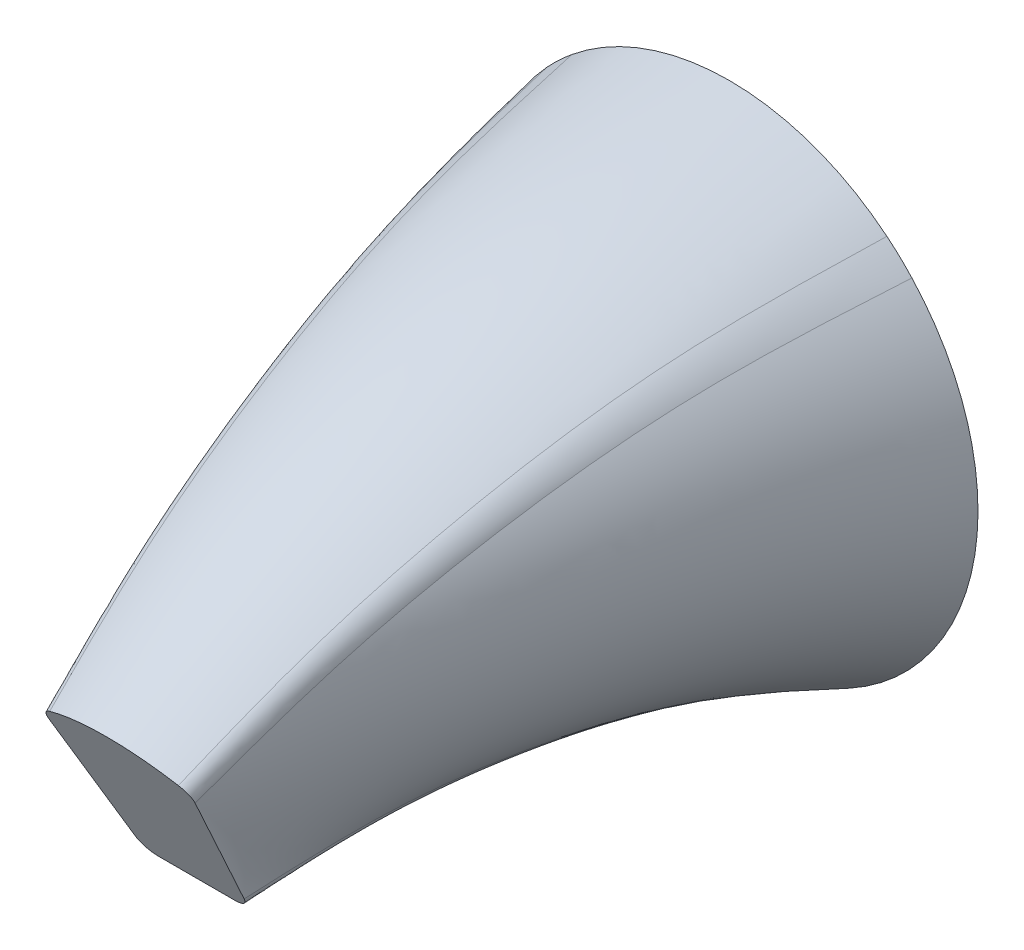
ISO-10303-21;
HEADER;
FILE_DESCRIPTION(('STEP AP214'),'2;1');
FILE_NAME('part.step','',(''),(''),'','','');
FILE_SCHEMA(('AUTOMOTIVE_DESIGN { 1 0 10303 214 1 1 1 1 }'));
ENDSEC;
DATA;
#1=APPLICATION_CONTEXT('core data for automotive mechanical design processes');
#2=APPLICATION_PROTOCOL_DEFINITION('international standard','automotive_design',2000,#1);
#3=PRODUCT_CONTEXT('',#1,'mechanical');
#4=PRODUCT('Part','Part','',(#3));
#5=PRODUCT_RELATED_PRODUCT_CATEGORY('part','',(#4));
#6=PRODUCT_DEFINITION_FORMATION('','',#4);
#7=PRODUCT_DEFINITION_CONTEXT('part definition',#1,'design');
#8=PRODUCT_DEFINITION('design','',#6,#7);
#9=PRODUCT_DEFINITION_SHAPE('','',#8);
#10=(LENGTH_UNIT() NAMED_UNIT(*) SI_UNIT(.MILLI.,.METRE.));
#11=(NAMED_UNIT(*) PLANE_ANGLE_UNIT() SI_UNIT($,.RADIAN.));
#12=(NAMED_UNIT(*) SI_UNIT($,.STERADIAN.) SOLID_ANGLE_UNIT());
#13=UNCERTAINTY_MEASURE_WITH_UNIT(LENGTH_MEASURE(1.E-05),#10,'distance_accuracy_value','');
#14=(GEOMETRIC_REPRESENTATION_CONTEXT(3) GLOBAL_UNCERTAINTY_ASSIGNED_CONTEXT((#13)) GLOBAL_UNIT_ASSIGNED_CONTEXT((#10,
#11,#12)) REPRESENTATION_CONTEXT('',''));
#15=CARTESIAN_POINT('',(0.,0.,0.));
#16=DIRECTION('',(0.,0.,1.));
#17=DIRECTION('',(1.,0.,0.));
#18=AXIS2_PLACEMENT_3D('',#15,#16,#17);
#19=CARTESIAN_POINT('',(-5.69104030061183,-24.6110355064771,82.9682517629207));
#20=DIRECTION('',(0.,-0.473205765637584,0.880951930225111));
#21=DIRECTION('',(0.,-0.880951930225111,-0.473205765637584));
#22=AXIS2_PLACEMENT_3D('',#19,#20,#21);
#23=PLANE('',#22);
#24=CARTESIAN_POINT('',(-5.69104030061183,-24.6110355064771,82.9682517629207));
#25=DIRECTION('',(0.,-0.473205765637584,0.880951930225111));
#26=DIRECTION('',(0.,-0.880951930225111,-0.473205765637584));
#27=AXIS2_PLACEMENT_3D('',#24,#25,#26);
#28=CIRCLE('',#27,2.54);
#29=CARTESIAN_POINT('',(-8.20944139143489,-24.9022243635643,82.8118388630388));
#30=VERTEX_POINT('',#29);
#31=CARTESIAN_POINT('',(-5.69104030061181,-26.8486534092489,81.7663091182012));
#32=VERTEX_POINT('',#31);
#33=EDGE_CURVE('E467',#30,#32,#28,.T.);
#34=ORIENTED_EDGE('',*,*,#33,.T.);
#35=DIRECTION('',(1.,0.,0.));
#36=VECTOR('',#35,1.);
#37=CARTESIAN_POINT('',(-5.69104030061181,-26.8486534092489,81.7663091182012));
#38=LINE('',#37,#36);
#39=CARTESIAN_POINT('',(5.92490500795103,-26.8486534092489,81.7663091182012));
#40=VERTEX_POINT('',#39);
#41=EDGE_CURVE('E487',#32,#40,#38,.T.);
#42=ORIENTED_EDGE('',*,*,#41,.T.);
#43=CARTESIAN_POINT('',(5.92490500795105,-24.6110355064771,82.9682517629207));
#44=DIRECTION('',(0.,-0.473205765637584,0.880951930225111));
#45=DIRECTION('',(0.,0.880951930225111,0.473205765637584));
#46=AXIS2_PLACEMENT_3D('',#43,#44,#45);
#47=CIRCLE('',#46,2.54);
#48=CARTESIAN_POINT('',(8.44330609877411,-24.9022243635643,82.8118388630388));
#49=VERTEX_POINT('',#48);
#50=EDGE_CURVE('E816',#40,#49,#47,.T.);
#51=ORIENTED_EDGE('',*,*,#50,.T.);
#52=DIRECTION('',(0.130133414076854,0.873460748835276,0.469181856836793));
#53=VECTOR('',#52,1.);
#54=CARTESIAN_POINT('',(11.3244534424501,-5.56384663664375,93.1995019403169));
#55=LINE('',#54,#53);
#56=CARTESIAN_POINT('',(11.3244534424501,-5.56384663664375,93.1995019403169));
#57=VERTEX_POINT('',#56);
#58=EDGE_CURVE('E807',#49,#57,#55,.T.);
#59=ORIENTED_EDGE('',*,*,#58,.T.);
#60=CARTESIAN_POINT('',(8.806052351627,-5.27265777955657,93.3559148401988));
#61=DIRECTION('',(0.,-0.473205765637584,0.880951930225111));
#62=DIRECTION('',(0.,0.880951930225111,0.473205765637584));
#63=AXIS2_PLACEMENT_3D('',#60,#61,#62);
#64=CIRCLE('',#63,2.54);
#65=CARTESIAN_POINT('',(9.97102754752189,-3.28427437344351,94.4239804857674));
#66=VERTEX_POINT('',#65);
#67=EDGE_CURVE('E798',#57,#66,#64,.T.);
#68=ORIENTED_EDGE('',*,*,#67,.T.);
#69=CARTESIAN_POINT('',(0.116932353669608,-20.1032757004745,85.389607409153));
#70=DIRECTION('',(0.,-0.473205765637584,0.880951930225111));
#71=DIRECTION('',(0.,-0.880951930225111,-0.473205765637584));
#72=AXIS2_PLACEMENT_3D('',#69,#70,#71);
#73=CIRCLE('',#72,21.4849224949877);
#74=CARTESIAN_POINT('',(-9.73716284018267,-3.28427437344351,94.4239804857674));
#75=VERTEX_POINT('',#74);
#76=EDGE_CURVE('E694',#66,#75,#73,.T.);
#77=ORIENTED_EDGE('',*,*,#76,.T.);
#78=CARTESIAN_POINT('',(-8.57218764428778,-5.27265777955656,93.3559148401988));
#79=DIRECTION('',(0.,-0.473205765637584,0.880951930225111));
#80=DIRECTION('',(0.,0.880951930225111,0.473205765637584));
#81=AXIS2_PLACEMENT_3D('',#78,#79,#80);
#82=CIRCLE('',#81,2.54);
#83=CARTESIAN_POINT('',(-11.0905887351108,-5.56384663664375,93.1995019403169));
#84=VERTEX_POINT('',#83);
#85=EDGE_CURVE('E469',#75,#84,#82,.T.);
#86=ORIENTED_EDGE('',*,*,#85,.T.);
#87=DIRECTION('',(0.130133414076854,-0.873460748835276,-0.469181856836793));
#88=VECTOR('',#87,1.);
#89=CARTESIAN_POINT('',(-11.0905887351108,-5.56384663664375,93.1995019403169));
#90=LINE('',#89,#88);
#91=EDGE_CURVE('E463',#84,#30,#90,.T.);
#92=ORIENTED_EDGE('',*,*,#91,.T.);
#93=EDGE_LOOP('',(#34,#42,#51,#59,#68,#77,#86,#92));
#94=FACE_BOUND('',#93,.T.);
#95=ADVANCED_FACE('F411',(#94),#23,.T.);
#96=CARTESIAN_POINT('',(0.,0.,0.));
#97=DIRECTION('',(0.,0.,1.));
#98=DIRECTION('',(1.,0.,0.));
#99=AXIS2_PLACEMENT_3D('',#96,#97,#98);
#100=PLANE('',#99);
#101=CARTESIAN_POINT('',(0.,0.,0.));
#102=DIRECTION('',(0.,0.,1.));
#103=DIRECTION('',(1.,0.,0.));
#104=AXIS2_PLACEMENT_3D('',#101,#102,#103);
#105=CIRCLE('',#104,38.1);
#106=CARTESIAN_POINT('',(-24.1359898163445,29.4798913767557,0.));
#107=VERTEX_POINT('',#106);
#108=CARTESIAN_POINT('',(-27.9692748887632,25.8714062663164,0.));
#109=VERTEX_POINT('',#108);
#110=EDGE_CURVE('E592',#107,#109,#105,.T.);
#111=ORIENTED_EDGE('',*,*,#110,.F.);
#112=CARTESIAN_POINT('',(0.,0.,0.));
#113=DIRECTION('',(0.,0.,1.));
#114=DIRECTION('',(1.,0.,0.));
#115=AXIS2_PLACEMENT_3D('',#112,#113,#114);
#116=CIRCLE('',#115,38.1);
#117=CARTESIAN_POINT('',(24.1359898163445,29.4798913767557,0.));
#118=VERTEX_POINT('',#117);
#119=EDGE_CURVE('E12',#118,#107,#116,.T.);
#120=ORIENTED_EDGE('',*,*,#119,.F.);
#121=CARTESIAN_POINT('',(0.,0.,0.));
#122=DIRECTION('',(0.,0.,1.));
#123=DIRECTION('',(1.,0.,0.));
#124=AXIS2_PLACEMENT_3D('',#121,#122,#123);
#125=CIRCLE('',#124,38.1);
#126=CARTESIAN_POINT('',(27.9692748887632,25.8714062663165,0.));
#127=VERTEX_POINT('',#126);
#128=EDGE_CURVE('E422',#127,#118,#125,.T.);
#129=ORIENTED_EDGE('',*,*,#128,.F.);
#130=CARTESIAN_POINT('',(0.,0.,0.));
#131=DIRECTION('',(0.,0.,1.));
#132=DIRECTION('',(1.,0.,0.));
#133=AXIS2_PLACEMENT_3D('',#130,#131,#132);
#134=CIRCLE('',#133,38.1);
#135=CARTESIAN_POINT('',(18.3740192015319,-33.3767197067318,0.));
#136=VERTEX_POINT('',#135);
#137=EDGE_CURVE('E632',#136,#127,#134,.T.);
#138=ORIENTED_EDGE('',*,*,#137,.F.);
#139=CARTESIAN_POINT('',(0.,0.,0.));
#140=DIRECTION('',(0.,0.,1.));
#141=DIRECTION('',(1.,0.,0.));
#142=AXIS2_PLACEMENT_3D('',#139,#140,#141);
#143=CIRCLE('',#142,38.1);
#144=CARTESIAN_POINT('',(14.386474148763,-35.2794467298875,0.));
#145=VERTEX_POINT('',#144);
#146=EDGE_CURVE('E607',#145,#136,#143,.T.);
#147=ORIENTED_EDGE('',*,*,#146,.F.);
#148=CARTESIAN_POINT('',(0.,0.,0.));
#149=DIRECTION('',(0.,0.,1.));
#150=DIRECTION('',(1.,0.,0.));
#151=AXIS2_PLACEMENT_3D('',#148,#149,#150);
#152=CIRCLE('',#151,38.1);
#153=CARTESIAN_POINT('',(-14.386474148763,-35.2794467298875,0.));
#154=VERTEX_POINT('',#153);
#155=EDGE_CURVE('E840',#154,#145,#152,.T.);
#156=ORIENTED_EDGE('',*,*,#155,.F.);
#157=CARTESIAN_POINT('',(0.,0.,0.));
#158=DIRECTION('',(0.,0.,1.));
#159=DIRECTION('',(1.,0.,0.));
#160=AXIS2_PLACEMENT_3D('',#157,#158,#159);
#161=CIRCLE('',#160,38.1);
#162=CARTESIAN_POINT('',(-18.3740192015319,-33.3767197067318,0.));
#163=VERTEX_POINT('',#162);
#164=EDGE_CURVE('E512',#163,#154,#161,.T.);
#165=ORIENTED_EDGE('',*,*,#164,.F.);
#166=CARTESIAN_POINT('',(0.,0.,0.));
#167=DIRECTION('',(0.,0.,1.));
#168=DIRECTION('',(1.,0.,0.));
#169=AXIS2_PLACEMENT_3D('',#166,#167,#168);
#170=CIRCLE('',#169,38.1);
#171=EDGE_CURVE('E494',#109,#163,#170,.T.);
#172=ORIENTED_EDGE('',*,*,#171,.F.);
#173=EDGE_LOOP('',(#111,#120,#129,#138,#147,#156,#165,#172));
#174=FACE_BOUND('',#173,.T.);
#175=ADVANCED_FACE('F571',(#174),#100,.F.);
#176=CARTESIAN_POINT('',(-14.386474148763,-35.2794467298875,0.));
#177=CARTESIAN_POINT('',(-13.576320510685,-32.6199387325879,6.77207624135138));
#178=CARTESIAN_POINT('',(-11.9390630192628,-27.2452799179885,20.4579156149024));
#179=CARTESIAN_POINT('',(-9.67847910384278,-24.0192962863836,41.8476294775739));
#180=CARTESIAN_POINT('',(-7.59019467537449,-23.7304617170327,62.4705647765063));
#181=CARTESIAN_POINT('',(-6.32394697315743,-25.8094938998875,75.3358653860432));
#182=CARTESIAN_POINT('',(-5.69104030061181,-26.8486534092489,81.7663091182012));
#183=CARTESIAN_POINT('',(-9.7754470748922,-37.1597602820071,0.));
#184=CARTESIAN_POINT('',(-9.2601338682828,-34.3052264479881,6.69294031423479));
#185=CARTESIAN_POINT('',(-8.21872595712224,-28.5364355858586,20.2188521340201));
#186=CARTESIAN_POINT('',(-6.54827825441251,-24.8368697629517,41.5764501685201));
#187=CARTESIAN_POINT('',(-5.08357998288867,-24.0965495462227,62.2773884903946));
#188=CARTESIAN_POINT('',(-4.19779165509864,-25.9314952668701,75.2714880178406));
#189=CARTESIAN_POINT('',(-3.75504941585134,-26.8486534092489,81.7663091182012));
#190=CARTESIAN_POINT('',(-4.8877235374461,-38.0999170580669,0.));
#191=CARTESIAN_POINT('',(-4.62614414911156,-35.1737311040285,6.64983577855201));
#192=CARTESIAN_POINT('',(-4.09751255008753,-29.2601368802104,20.088636684254));
#193=CARTESIAN_POINT('',(-3.24319513091234,-25.2612121199466,41.4328834489133));
#194=CARTESIAN_POINT('',(-2.49593302988046,-24.2760893642761,62.1825972804392));
#195=CARTESIAN_POINT('',(-2.04463176118357,-25.9913281853225,75.2398981744468));
#196=CARTESIAN_POINT('',(-1.81905853109087,-26.8486534092489,81.7663091182012));
#197=CARTESIAN_POINT('',(4.88772353744608,-38.0999170580669,0.));
#198=CARTESIAN_POINT('',(4.64793332568141,-35.1737311040285,6.649835778552));
#199=CARTESIAN_POINT('',(4.16333595781328,-29.2601368802104,20.0886366842539));
#200=CARTESIAN_POINT('',(3.36981720665486,-25.2612121199466,41.4328834489133));
#201=CARTESIAN_POINT('',(2.67871975884596,-24.2760893642761,62.1825972804391));
#202=CARTESIAN_POINT('',(2.26147436976006,-25.9913281853224,75.2398981744468));
#203=CARTESIAN_POINT('',(2.05292323843008,-26.8486534092489,81.7663091182012));
#204=CARTESIAN_POINT('',(9.77544707489218,-37.1597602820071,0.));
#205=CARTESIAN_POINT('',(9.28192304485265,-34.3052264479881,6.69294031423479));
#206=CARTESIAN_POINT('',(8.284549364848,-28.5364355858586,20.2188521340201));
#207=CARTESIAN_POINT('',(6.67490033015503,-24.8368697629517,41.5764501685201));
#208=CARTESIAN_POINT('',(5.26636671185418,-24.0965495462227,62.2773884903946));
#209=CARTESIAN_POINT('',(4.41463426367514,-25.9314952668701,75.2714880178406));
#210=CARTESIAN_POINT('',(3.98891412319055,-26.8486534092489,81.7663091182012));
#211=CARTESIAN_POINT('',(14.386474148763,-35.2794467298875,0.));
#212=CARTESIAN_POINT('',(13.5981096872548,-32.6199387325879,6.77207624135138));
#213=CARTESIAN_POINT('',(12.0048864269886,-27.2452799179885,20.4579156149024));
#214=CARTESIAN_POINT('',(9.80510117958531,-24.0192962863836,41.8476294775739));
#215=CARTESIAN_POINT('',(7.77298140433999,-23.7304617170327,62.4705647765063));
#216=CARTESIAN_POINT('',(6.54078958173392,-25.8094938998875,75.3358653860432));
#217=CARTESIAN_POINT('',(5.92490500795103,-26.8486534092489,81.7663091182012));
#218=B_SPLINE_SURFACE_WITH_KNOTS('',3,3,((#176,#177,#178,#179,#180,#181,#182),(#183,#184,#185,
#186,#187,#188,#189),(#190,#191,#192,#193,#194,#195,#196),(#197,#198,#199,#200,#201,#202,#203),
(#204,#205,#206,#207,#208,#209,#210),(#211,#212,#213,#214,#215,#216,#217)),.UNSPECIFIED.,.F.,
.F.,.F.,(4,2,4),(4,1,1,1,4),(0.,0.5,1.),(0.,0.274795785761233,0.555340910294671,
0.777746720179776,1.),.UNSPECIFIED.);
#219=CARTESIAN_POINT('',(14.386474148763,-35.2794467298875,0.));
#220=CARTESIAN_POINT('',(13.5981096872548,-32.6199387325879,6.77207624135138));
#221=CARTESIAN_POINT('',(12.0048864269886,-27.2452799179885,20.4579156149024));
#222=CARTESIAN_POINT('',(9.80510117958531,-24.0192962863836,41.8476294775739));
#223=CARTESIAN_POINT('',(7.77298140433999,-23.7304617170327,62.4705647765063));
#224=CARTESIAN_POINT('',(6.54078958173392,-25.8094938998875,75.3358653860432));
#225=CARTESIAN_POINT('',(5.92490500795103,-26.8486534092489,81.7663091182012));
#226=B_SPLINE_CURVE_WITH_KNOTS('',3,(#219,#220,#221,#222,#223,#224,#225),.UNSPECIFIED.,.F.,.F.,
(4,1,1,1,4),(0.,0.274795785761233,0.555340910294671,0.777746720179776,1.),.UNSPECIFIED.);
#227=EDGE_CURVE('E585',#145,#40,#226,.T.);
#228=CARTESIAN_POINT('',(-14.386474148763,-35.2794467298875,0.));
#229=CARTESIAN_POINT('',(-13.576320510685,-32.6199387325879,6.77207624135138));
#230=CARTESIAN_POINT('',(-11.9390630192628,-27.2452799179885,20.4579156149024));
#231=CARTESIAN_POINT('',(-9.67847910384278,-24.0192962863836,41.8476294775739));
#232=CARTESIAN_POINT('',(-7.59019467537449,-23.7304617170327,62.4705647765063));
#233=CARTESIAN_POINT('',(-6.32394697315743,-25.8094938998875,75.3358653860432));
#234=CARTESIAN_POINT('',(-5.69104030061181,-26.8486534092489,81.7663091182012));
#235=B_SPLINE_CURVE_WITH_KNOTS('',3,(#228,#229,#230,#231,#232,#233,#234),.UNSPECIFIED.,.F.,.F.,
(4,1,1,1,4),(0.,0.274795785761233,0.555340910294671,0.777746720179776,1.),.UNSPECIFIED.);
#236=EDGE_CURVE('E486',#32,#154,#235,.F.);
#237=ORIENTED_EDGE('',*,*,#155,.T.);
#238=ORIENTED_EDGE('',*,*,#227,.T.);
#239=ORIENTED_EDGE('',*,*,#41,.F.);
#240=ORIENTED_EDGE('',*,*,#236,.T.);
#241=EDGE_LOOP('',(#237,#238,#239,#240));
#242=FACE_BOUND('',#241,.T.);
#243=ADVANCED_FACE('F560',(#242),#218,.T.);
#244=CARTESIAN_POINT('',(14.386474148763,-35.2794467298875,0.));
#245=CARTESIAN_POINT('',(13.5981096872548,-32.6199387325879,6.77207624135138));
#246=CARTESIAN_POINT('',(12.0048864269886,-27.2452799179885,20.4579156149024));
#247=CARTESIAN_POINT('',(9.80510117958531,-24.0192962863836,41.8476294775739));
#248=CARTESIAN_POINT('',(7.77298140433999,-23.7304617170327,62.4705647765063));
#249=CARTESIAN_POINT('',(6.54078958173393,-25.8094938998875,75.3358653860432));
#250=CARTESIAN_POINT('',(5.92490500795103,-26.8486534092489,81.7663091182012));
#251=CARTESIAN_POINT('',(15.0692544264946,-35.0010183041223,0.));
#252=CARTESIAN_POINT('',(14.2681811208765,-32.371795431809,6.78371625590305));
#253=CARTESIAN_POINT('',(12.6492742751172,-27.058340499328,20.4930791935403));
#254=CARTESIAN_POINT('',(10.4268151999958,-23.9097192613576,41.8844013176747));
#255=CARTESIAN_POINT('',(8.33691595721151,-23.6843849743596,62.4949784355415));
#256=CARTESIAN_POINT('',(7.15358113303567,-25.7941384984127,75.3440014111658));
#257=CARTESIAN_POINT('',(6.56211667883356,-26.8486534092489,81.7663091182012));
#258=CARTESIAN_POINT('',(15.7431627512059,-34.7031372098562,0.));
#259=CARTESIAN_POINT('',(14.9374180270896,-32.0767368366688,6.79768266046645));
#260=CARTESIAN_POINT('',(13.3090706078732,-26.7689859553961,20.5352706154645));
#261=CARTESIAN_POINT('',(11.0795522681832,-23.660350124114,41.9560061022452));
#262=CARTESIAN_POINT('',(8.99639073903257,-23.4724567650431,62.5824474760083));
#263=CARTESIAN_POINT('',(7.76549329361857,-25.5846176573624,75.4477585262297));
#264=CARTESIAN_POINT('',(7.15025568642855,-26.6403358394355,81.8782074769393));
#265=CARTESIAN_POINT('',(17.0725672002437,-34.0687885726838,0.));
#266=CARTESIAN_POINT('',(16.2348748899444,-31.4255424132706,6.82771923959545));
#267=CARTESIAN_POINT('',(14.5419638838322,-26.0837475082465,20.6260087848651));
#268=CARTESIAN_POINT('',(12.2127922889956,-22.946164424003,42.1457755457825));
#269=CARTESIAN_POINT('',(10.0586975882284,-22.7226513854969,62.8839531003027));
#270=CARTESIAN_POINT('',(8.71900543341664,-24.8714034939488,75.7971197362118));
#271=CARTESIAN_POINT('',(8.04938913128805,-25.945411008201,82.2514882718867));
#272=CARTESIAN_POINT('',(17.7280633245701,-33.7323210297774,0.));
#273=CARTESIAN_POINT('',(16.8637822987915,-31.0689656208595,6.84382079110283));
#274=CARTESIAN_POINT('',(15.1171375666799,-25.6865314866191,20.6746503196422));
#275=CARTESIAN_POINT('',(12.6855214752168,-22.4863343202548,42.2635853916962));
#276=CARTESIAN_POINT('',(10.4348861518459,-22.2045611903859,63.0897307060365));
#277=CARTESIAN_POINT('',(9.05172627593176,-24.3743043214601,76.0399714680712));
#278=CARTESIAN_POINT('',(8.36038356855255,-25.4588037467799,82.5128707080961));
#279=CARTESIAN_POINT('',(18.3740192015319,-33.3767197067318,0.));
#280=CARTESIAN_POINT('',(17.4487745858628,-30.6922727962341,6.86026381517516));
#281=CARTESIAN_POINT('',(15.5789271801337,-25.2672143777299,20.7243234164794));
#282=CARTESIAN_POINT('',(12.9972031740891,-22.0181782844448,42.3867433620433));
#283=CARTESIAN_POINT('',(10.6122556374593,-21.7380364729406,63.2713856686995));
#284=CARTESIAN_POINT('',(9.16612392427087,-23.8477362946762,76.2998441691855));
#285=CARTESIAN_POINT('',(8.44330609877411,-24.9022243635643,82.8118388630388));
#286=B_SPLINE_SURFACE_WITH_KNOTS('',3,3,((#244,#245,#246,#247,#248,#249,#250),(#251,#252,#253,
#254,#255,#256,#257),(#258,#259,#260,#261,#262,#263,#264),(#265,#266,#267,#268,#269,#270,#271),
(#272,#273,#274,#275,#276,#277,#278),(#279,#280,#281,#282,#283,#284,#285)),.UNSPECIFIED.,.F.,
.F.,.F.,(4,2,4),(4,1,1,1,4),(0.,0.5,1.),(0.,0.274795785761233,0.555340910294671,
0.777746720179776,1.),.UNSPECIFIED.);
#287=CARTESIAN_POINT('',(18.3740192015319,-33.3767197067318,0.));
#288=CARTESIAN_POINT('',(17.4487745858628,-30.6922727962341,6.86026381517516));
#289=CARTESIAN_POINT('',(15.5789271801337,-25.2672143777299,20.7243234164794));
#290=CARTESIAN_POINT('',(12.9972031740891,-22.0181782844448,42.3867433620433));
#291=CARTESIAN_POINT('',(10.6122556374593,-21.7380364729406,63.2713856686995));
#292=CARTESIAN_POINT('',(9.16612392427087,-23.8477362946762,76.2998441691855));
#293=CARTESIAN_POINT('',(8.44330609877411,-24.9022243635643,82.8118388630388));
#294=B_SPLINE_CURVE_WITH_KNOTS('',3,(#287,#288,#289,#290,#291,#292,#293),.UNSPECIFIED.,.F.,.F.,
(4,1,1,1,4),(0.,0.274795785761233,0.555340910294671,0.777746720179776,1.),.UNSPECIFIED.);
#295=EDGE_CURVE('E612',#136,#49,#294,.T.);
#296=ORIENTED_EDGE('',*,*,#146,.T.);
#297=ORIENTED_EDGE('',*,*,#295,.T.);
#298=ORIENTED_EDGE('',*,*,#50,.F.);
#299=ORIENTED_EDGE('',*,*,#227,.F.);
#300=EDGE_LOOP('',(#296,#297,#298,#299));
#301=FACE_BOUND('',#300,.T.);
#302=ADVANCED_FACE('F530',(#301),#286,.T.);
#303=CARTESIAN_POINT('',(-18.3740192015319,-33.3767197067318,0.));
#304=CARTESIAN_POINT('',(-17.426985409293,-30.6922727962341,6.86026381517516));
#305=CARTESIAN_POINT('',(-15.513103772408,-25.2672143777299,20.7243234164794));
#306=CARTESIAN_POINT('',(-12.8705810983466,-22.0181782844448,42.3867433620433));
#307=CARTESIAN_POINT('',(-10.4294689084938,-21.7380364729406,63.2713856686995));
#308=CARTESIAN_POINT('',(-8.94928131569437,-23.8477362946762,76.2998441691855));
#309=CARTESIAN_POINT('',(-8.2094413914349,-24.9022243635643,82.8118388630388));
#310=CARTESIAN_POINT('',(-17.7280633245701,-33.7323210297774,0.));
#311=CARTESIAN_POINT('',(-16.8419931222216,-31.0689656208595,6.84382079110284));
#312=CARTESIAN_POINT('',(-15.0513141589541,-25.6865314866191,20.6746503196422));
#313=CARTESIAN_POINT('',(-12.5588993994743,-22.4863343202548,42.2635853916963));
#314=CARTESIAN_POINT('',(-10.2520994228804,-22.2045611903859,63.0897307060364));
#315=CARTESIAN_POINT('',(-8.83488366735526,-24.3743043214601,76.0399714680712));
#316=CARTESIAN_POINT('',(-8.12651886121334,-25.4588037467799,82.5128707080961));
#317=CARTESIAN_POINT('',(-17.0725672002437,-34.0687885726838,0.));
#318=CARTESIAN_POINT('',(-16.2130857133746,-31.4255424132705,6.82771923959545));
#319=CARTESIAN_POINT('',(-14.4761404761065,-26.0837475082465,20.6260087848651));
#320=CARTESIAN_POINT('',(-12.0861702132531,-22.946164424003,42.1457755457825));
#321=CARTESIAN_POINT('',(-9.87591085926295,-22.7226513854969,62.8839531003027));
#322=CARTESIAN_POINT('',(-8.50216282484015,-24.8714034939488,75.7971197362118));
#323=CARTESIAN_POINT('',(-7.81552442394883,-25.945411008201,82.2514882718867));
#324=CARTESIAN_POINT('',(-15.7431627512059,-34.7031372098562,0.));
#325=CARTESIAN_POINT('',(-14.9156288505198,-32.0767368366688,6.79768266046645));
#326=CARTESIAN_POINT('',(-13.2432472001474,-26.7689859553961,20.5352706154645));
#327=CARTESIAN_POINT('',(-10.9529301924406,-23.660350124114,41.9560061022452));
#328=CARTESIAN_POINT('',(-8.81360401006706,-23.4724567650431,62.5824474760083));
#329=CARTESIAN_POINT('',(-7.54865068504207,-25.5846176573624,75.4477585262297));
#330=CARTESIAN_POINT('',(-6.91639097908934,-26.6403358394355,81.8782074769393));
#331=CARTESIAN_POINT('',(-15.0692544264946,-35.0010183041223,0.));
#332=CARTESIAN_POINT('',(-14.2463919443067,-32.371795431809,6.78371625590305));
#333=CARTESIAN_POINT('',(-12.5834508673914,-27.058340499328,20.4930791935403));
#334=CARTESIAN_POINT('',(-10.3001931242533,-23.9097192613576,41.8844013176747));
#335=CARTESIAN_POINT('',(-8.15412922824601,-23.6843849743596,62.4949784355415));
#336=CARTESIAN_POINT('',(-6.93673852445917,-25.7941384984127,75.3440014111658));
#337=CARTESIAN_POINT('',(-6.32825197149434,-26.8486534092489,81.7663091182012));
#338=CARTESIAN_POINT('',(-14.386474148763,-35.2794467298875,0.));
#339=CARTESIAN_POINT('',(-13.576320510685,-32.6199387325879,6.77207624135138));
#340=CARTESIAN_POINT('',(-11.9390630192628,-27.2452799179885,20.4579156149024));
#341=CARTESIAN_POINT('',(-9.67847910384278,-24.0192962863836,41.8476294775739));
#342=CARTESIAN_POINT('',(-7.59019467537449,-23.7304617170327,62.4705647765063));
#343=CARTESIAN_POINT('',(-6.32394697315743,-25.8094938998875,75.3358653860432));
#344=CARTESIAN_POINT('',(-5.69104030061181,-26.8486534092489,81.7663091182012));
#345=B_SPLINE_SURFACE_WITH_KNOTS('',3,3,((#303,#304,#305,#306,#307,#308,#309),(#310,#311,#312,
#313,#314,#315,#316),(#317,#318,#319,#320,#321,#322,#323),(#324,#325,#326,#327,#328,#329,#330),
(#331,#332,#333,#334,#335,#336,#337),(#338,#339,#340,#341,#342,#343,#344)),.UNSPECIFIED.,.F.,
.F.,.F.,(4,2,4),(4,1,1,1,4),(0.,0.5,1.),(0.,0.274795785761233,0.555340910294671,
0.777746720179776,1.),.UNSPECIFIED.);
#346=CARTESIAN_POINT('',(-18.3740192015319,-33.3767197067318,0.));
#347=CARTESIAN_POINT('',(-17.426985409293,-30.6922727962341,6.86026381517516));
#348=CARTESIAN_POINT('',(-15.513103772408,-25.2672143777299,20.7243234164794));
#349=CARTESIAN_POINT('',(-12.8705810983466,-22.0181782844448,42.3867433620433));
#350=CARTESIAN_POINT('',(-10.4294689084938,-21.7380364729406,63.2713856686995));
#351=CARTESIAN_POINT('',(-8.94928131569437,-23.8477362946762,76.2998441691855));
#352=CARTESIAN_POINT('',(-8.20944139143489,-24.9022243635642,82.8118388630388));
#353=B_SPLINE_CURVE_WITH_KNOTS('',3,(#346,#347,#348,#349,#350,#351,#352),.UNSPECIFIED.,.F.,.F.,
(4,1,1,1,4),(0.,0.274795785761233,0.555340910294671,0.777746720179776,1.),.UNSPECIFIED.);
#354=EDGE_CURVE('E474',#163,#30,#353,.T.);
#355=ORIENTED_EDGE('',*,*,#164,.T.);
#356=ORIENTED_EDGE('',*,*,#236,.F.);
#357=ORIENTED_EDGE('',*,*,#33,.F.);
#358=ORIENTED_EDGE('',*,*,#354,.F.);
#359=EDGE_LOOP('',(#355,#356,#357,#358));
#360=FACE_BOUND('',#359,.T.);
#361=ADVANCED_FACE('F483',(#360),#345,.T.);
#362=CARTESIAN_POINT('',(18.3740192015319,-33.3767197067318,0.));
#363=CARTESIAN_POINT('',(17.4487745858628,-30.6922727962341,6.86026381517516));
#364=CARTESIAN_POINT('',(15.5789271801337,-25.2672143777299,20.7243234164794));
#365=CARTESIAN_POINT('',(12.9972031740891,-22.0181782844449,42.3867433620433));
#366=CARTESIAN_POINT('',(10.6122556374593,-21.7380364729406,63.2713856686995));
#367=CARTESIAN_POINT('',(9.16612392427087,-23.8477362946762,76.2998441691855));
#368=CARTESIAN_POINT('',(8.44330609877411,-24.9022243635643,82.8118388630388));
#369=CARTESIAN_POINT('',(23.5073553434816,-30.5507973971443,0.));
#370=CARTESIAN_POINT('',(21.9916741806099,-28.0724601370715,6.97478644673046));
#371=CARTESIAN_POINT('',(18.9286004352324,-23.0639332915327,21.0702873792075));
#372=CARTESIAN_POINT('',(15.5646470653934,-19.8825476079227,42.991511298337));
#373=CARTESIAN_POINT('',(12.0237722363512,-19.8722654755138,64.0563770378403));
#374=CARTESIAN_POINT('',(9.79660389300452,-22.1514776931468,77.1386065003782));
#375=CARTESIAN_POINT('',(8.68340171074711,-23.2906928863209,83.677477452812));
#376=CARTESIAN_POINT('',(27.8479509674046,-26.6215601450533,0.));
#377=CARTESIAN_POINT('',(25.9925718396233,-24.4295452845007,7.13881874963589));
#378=CARTESIAN_POINT('',(22.242994927774,-19.9996537391608,21.565816208382));
#379=CARTESIAN_POINT('',(17.7989787164837,-17.2239174566877,43.7664116079743));
#380=CARTESIAN_POINT('',(13.2285796245945,-17.7706816992233,64.9607626921592));
#381=CARTESIAN_POINT('',(10.3581965503987,-20.3766328096397,78.0171578243759));
#382=CARTESIAN_POINT('',(8.9234973227201,-21.6791614090775,84.5431160425852));
#383=CARTESIAN_POINT('',(34.4308678525605,-17.2838414873307,0.));
#384=CARTESIAN_POINT('',(32.1337317882109,-15.6251849152053,7.5542182900415));
#385=CARTESIAN_POINT('',(27.4913984659848,-12.2731689878914,22.8207059115126));
#386=CARTESIAN_POINT('',(21.2201282181374,-11.1957761925373,45.5646304253145));
#387=CARTESIAN_POINT('',(15.1157667122617,-13.2656276854771,66.9206835024461));
#388=CARTESIAN_POINT('',(11.3072791305328,-16.7263372371355,79.8246321164127));
#389=CARTESIAN_POINT('',(9.40368854666609,-18.4560984545908,86.2743932221315));
#390=CARTESIAN_POINT('',(36.6731891137934,-11.8753600816992,0.));
#391=CARTESIAN_POINT('',(34.2604826065151,-10.4669400344802,7.80519559141304));
#392=CARTESIAN_POINT('',(29.3845904078261,-7.62063266141368,23.5788888187521));
#393=CARTESIAN_POINT('',(22.4048299291864,-7.83050072770691,46.5863610446251));
#394=CARTESIAN_POINT('',(15.7971992840232,-10.8629948036832,67.9757849680865));
#395=CARTESIAN_POINT('',(11.6944534162582,-14.8511656028549,80.7534105540727));
#396=CARTESIAN_POINT('',(9.64378415863909,-16.8445669773474,87.1400318119047));
#397=CARTESIAN_POINT('',(38.5467639469322,-0.306538848361983,0.));
#398=CARTESIAN_POINT('',(36.0222749255135,0.4576318688461,8.3304104471253));
#399=CARTESIAN_POINT('',(30.9204789598295,2.00196145359309,25.1655220483435));
#400=CARTESIAN_POINT('',(23.5136971649495,-0.883533064888419,48.6991315058425));
#401=CARTESIAN_POINT('',(16.5705161605247,-5.97552211967768,70.130841780248));
#402=CARTESIAN_POINT('',(12.2723308440547,-11.0734262946916,82.6259153034972));
#403=CARTESIAN_POINT('',(10.1239753825851,-13.6215040228606,88.871308991451));
#404=CARTESIAN_POINT('',(38.1260983804725,5.53321424871623,0.));
#405=CARTESIAN_POINT('',(35.6248619083889,6.0234967603032,8.6025231658835));
#406=CARTESIAN_POINT('',(30.5700575364033,7.01431958363006,25.9875534076635));
#407=CARTESIAN_POINT('',(23.4342471219029,2.67603631444252,49.7874900742415));
#408=CARTESIAN_POINT('',(16.6627966373001,-3.48817816341841,71.230301748551));
#409=CARTESIAN_POINT('',(12.4631660132681,-9.17002409370196,83.569476526955));
#410=CARTESIAN_POINT('',(10.3640709945581,-12.0099725456173,89.7369475812242));
#411=CARTESIAN_POINT('',(34.8268636953281,16.4713509702969,0.));
#412=CARTESIAN_POINT('',(32.5621348684258,16.3143785069325,9.09234852528716));
#413=CARTESIAN_POINT('',(27.9852940525507,15.9971493672842,27.4672777213873));
#414=CARTESIAN_POINT('',(22.0498835063169,9.44379176591651,51.8351451147888));
#415=CARTESIAN_POINT('',(16.2480731978394,1.3478245753138,73.3639449132192));
#416=CARTESIAN_POINT('',(12.6451205749628,-5.4094375100522,85.4348450263926));
#417=CARTESIAN_POINT('',(10.8442622185041,-8.7869095911305,91.4682247607705));
#418=CARTESIAN_POINT('',(31.9482945766435,21.5697345947994,0.));
#419=CARTESIAN_POINT('',(29.9086458445892,21.03213071833,9.30908133572511));
#420=CARTESIAN_POINT('',(25.786674394399,19.9456750970787,28.1220106849423));
#421=CARTESIAN_POINT('',(20.7456261216547,12.6474075290538,52.7923145961895));
#422=CARTESIAN_POINT('',(15.7416865092111,3.69539959607519,74.3976671646675));
#423=CARTESIAN_POINT('',(12.6364456629247,-3.55261429867326,86.3564986892075));
#424=CARTESIAN_POINT('',(11.0843578304771,-7.17537811388713,92.3338633505437));
#425=CARTESIAN_POINT('',(27.9692748887632,25.8714062663164,0.));
#426=CARTESIAN_POINT('',(26.4184767474195,24.9498327086695,9.48178122658445));
#427=CARTESIAN_POINT('',(23.284434319835,23.0874042256802,28.6437236231886));
#428=CARTESIAN_POINT('',(18.957218876229,15.4553457060435,53.6154806422245));
#429=CARTESIAN_POINT('',(14.9598195459631,5.87643466487122,75.3491191234293));
#430=CARTESIAN_POINT('',(12.5359649944518,-1.75129170812062,87.2507351931621));
#431=CARTESIAN_POINT('',(11.3244534424501,-5.56384663664375,93.1995019403169));
#432=B_SPLINE_SURFACE_WITH_KNOTS('',3,3,((#362,#363,#364,#365,#366,#367,#368),(#369,#370,#371,
#372,#373,#374,#375),(#376,#377,#378,#379,#380,#381,#382),(#383,#384,#385,#386,#387,#388,#389),
(#390,#391,#392,#393,#394,#395,#396),(#397,#398,#399,#400,#401,#402,#403),(#404,#405,#406,#407,
#408,#409,#410),(#411,#412,#413,#414,#415,#416,#417),(#418,#419,#420,#421,#422,#423,#424),(#425,
#426,#427,#428,#429,#430,#431)),.UNSPECIFIED.,.F.,.F.,.F.,(4,2,2,2,4),(4,1,1,1,4),(0.,0.25,0.5,
0.75,1.),(0.,0.274795785761233,0.555340910294671,0.777746720179776,1.),.UNSPECIFIED.);
#433=CARTESIAN_POINT('',(27.9692748887632,25.8714062663164,0.));
#434=CARTESIAN_POINT('',(26.4184767474195,24.9498327086695,9.48178122658445));
#435=CARTESIAN_POINT('',(23.284434319835,23.0874042256802,28.6437236231886));
#436=CARTESIAN_POINT('',(18.957218876229,15.4553457060435,53.6154806422245));
#437=CARTESIAN_POINT('',(14.9598195459631,5.87643466487122,75.3491191234293));
#438=CARTESIAN_POINT('',(12.5359649944518,-1.75129170812062,87.2507351931621));
#439=CARTESIAN_POINT('',(11.3244534424501,-5.56384663664375,93.1995019403169));
#440=B_SPLINE_CURVE_WITH_KNOTS('',3,(#433,#434,#435,#436,#437,#438,#439),.UNSPECIFIED.,.F.,.F.,
(4,1,1,1,4),(0.,0.274795785761233,0.555340910294671,0.777746720179776,1.),.UNSPECIFIED.);
#441=EDGE_CURVE('E619',#127,#57,#440,.T.);
#442=ORIENTED_EDGE('',*,*,#137,.T.);
#443=ORIENTED_EDGE('',*,*,#441,.T.);
#444=ORIENTED_EDGE('',*,*,#58,.F.);
#445=ORIENTED_EDGE('',*,*,#295,.F.);
#446=EDGE_LOOP('',(#442,#443,#444,#445));
#447=FACE_BOUND('',#446,.T.);
#448=ADVANCED_FACE('F529',(#447),#432,.T.);
#449=CARTESIAN_POINT('',(27.9692748887632,25.8714062663165,0.));
#450=CARTESIAN_POINT('',(26.4184767474195,24.9498327086695,9.48178122658445));
#451=CARTESIAN_POINT('',(23.284434319835,23.0874042256801,28.6437236231886));
#452=CARTESIAN_POINT('',(18.957218876229,15.4553457060435,53.6154806422245));
#453=CARTESIAN_POINT('',(14.9598195459631,5.87643466487122,75.3491191234293));
#454=CARTESIAN_POINT('',(12.5359649944518,-1.75129170812063,87.2507351931621));
#455=CARTESIAN_POINT('',(11.3244534424501,-5.56384663664376,93.1995019403169));
#456=CARTESIAN_POINT('',(27.3726185679231,26.5164444401177,0.));
#457=CARTESIAN_POINT('',(25.8897916312179,25.5768814797198,9.51033295661137));
#458=CARTESIAN_POINT('',(22.893113721627,23.6780978129284,28.7299761789386));
#459=CARTESIAN_POINT('',(18.7401282758547,15.993371271297,53.7666246536172));
#460=CARTESIAN_POINT('',(14.8928252203757,6.34297453733503,75.5396197906408));
#461=CARTESIAN_POINT('',(12.5600765874569,-1.28412073412935,87.4816477840173));
#462=CARTESIAN_POINT('',(11.3941023688574,-5.09636022013116,93.450613561804));
#463=CARTESIAN_POINT('',(26.7542355959157,27.140248978092,0.));
#464=CARTESIAN_POINT('',(25.3154703502523,26.1923186700233,9.53896584184145));
#465=CARTESIAN_POINT('',(22.4078376912812,24.2766252443746,28.8164738982453));
#466=CARTESIAN_POINT('',(18.4001252637312,16.5583058987835,53.9229283187945));
#467=CARTESIAN_POINT('',(14.6893401418454,6.87610666145555,75.7589384308072));
#468=CARTESIAN_POINT('',(12.425217680552,-0.798570863030135,87.720115767237));
#469=CARTESIAN_POINT('',(11.2935447774509,-4.63459331454432,93.6986529321797));
#470=CARTESIAN_POINT('',(25.4758595162235,28.3436557067755,0.));
#471=CARTESIAN_POINT('',(24.1060436245844,27.3709895863035,9.59411172004721));
#472=CARTESIAN_POINT('',(21.3377522474381,25.4053070076592,28.9830653072366));
#473=CARTESIAN_POINT('',(17.5334508265533,17.5872672595048,54.2112511108718));
#474=CARTESIAN_POINT('',(14.0063188661842,7.81944796787144,76.1499518052346));
#475=CARTESIAN_POINT('',(11.881734191512,0.0478096611407795,88.1361918884422));
#476=CARTESIAN_POINT('',(10.8198062491087,-3.83667655141372,94.1272561281745));
#477=CARTESIAN_POINT('',(24.8158664085389,28.9232578974847,0.));
#478=CARTESIAN_POINT('',(23.4706413069847,27.9345775903105,9.62066647438825));
#479=CARTESIAN_POINT('',(20.7520460040077,25.9365315858729,29.0632851547578));
#480=CARTESIAN_POINT('',(17.0101364647797,18.0472877874655,54.3427979967978));
#481=CARTESIAN_POINT('',(13.5353028552359,8.21683289535248,76.3162153711217));
#482=CARTESIAN_POINT('',(11.4759490218849,0.404366540289588,88.3119900510252));
#483=CARTESIAN_POINT('',(10.446625312173,-3.50052669386995,94.3078199537936));
#484=CARTESIAN_POINT('',(24.1359898163444,29.4798913767557,0.));
#485=CARTESIAN_POINT('',(22.8162401735173,28.4556936371199,9.64476785102966));
#486=CARTESIAN_POINT('',(20.1491287912287,26.3858696641084,29.1360935390643));
#487=CARTESIAN_POINT('',(16.4666114578077,18.4007513869269,54.4477540619116));
#488=CARTESIAN_POINT('',(13.0647719806306,8.47735344586638,76.4279887598359));
#489=CARTESIAN_POINT('',(11.0020398342982,0.635371562537671,88.4266885363749));
#490=CARTESIAN_POINT('',(9.97102754752189,-3.28427437344351,94.4239804857674));
#491=B_SPLINE_SURFACE_WITH_KNOTS('',3,3,((#449,#450,#451,#452,#453,#454,#455),(#456,#457,#458,
#459,#460,#461,#462),(#463,#464,#465,#466,#467,#468,#469),(#470,#471,#472,#473,#474,#475,#476),
(#477,#478,#479,#480,#481,#482,#483),(#484,#485,#486,#487,#488,#489,#490)),.UNSPECIFIED.,.F.,
.F.,.F.,(4,2,4),(4,1,1,1,4),(0.,0.5,1.),(0.,0.274795785761233,0.555340910294671,
0.777746720179776,1.),.UNSPECIFIED.);
#492=CARTESIAN_POINT('',(24.1359898163444,29.4798913767557,0.));
#493=CARTESIAN_POINT('',(22.8162401735173,28.4556936371199,9.64476785102966));
#494=CARTESIAN_POINT('',(20.1491287912287,26.3858696641084,29.1360935390643));
#495=CARTESIAN_POINT('',(16.4666114578077,18.4007513869269,54.4477540619116));
#496=CARTESIAN_POINT('',(13.0647719806306,8.47735344586638,76.4279887598359));
#497=CARTESIAN_POINT('',(11.0020398342982,0.635371562537671,88.4266885363749));
#498=CARTESIAN_POINT('',(9.97102754752189,-3.28427437344351,94.4239804857674));
#499=B_SPLINE_CURVE_WITH_KNOTS('',3,(#492,#493,#494,#495,#496,#497,#498),.UNSPECIFIED.,.F.,.F.,
(4,1,1,1,4),(0.,0.274795785761233,0.555340910294671,0.777746720179776,1.),.UNSPECIFIED.);
#500=EDGE_CURVE('E643',#118,#66,#499,.T.);
#501=ORIENTED_EDGE('',*,*,#128,.T.);
#502=ORIENTED_EDGE('',*,*,#500,.T.);
#503=ORIENTED_EDGE('',*,*,#67,.F.);
#504=ORIENTED_EDGE('',*,*,#441,.F.);
#505=EDGE_LOOP('',(#501,#502,#503,#504));
#506=FACE_BOUND('',#505,.T.);
#507=ADVANCED_FACE('F659',(#506),#491,.T.);
#508=CARTESIAN_POINT('',(24.1359898163445,29.4798913767557,0.));
#509=CARTESIAN_POINT('',(22.8162401735173,28.4556936371199,9.64476785102966));
#510=CARTESIAN_POINT('',(20.1491287912287,26.3858696641084,29.1360935390643));
#511=CARTESIAN_POINT('',(16.4666114578077,18.4007513869269,54.4477540619116));
#512=CARTESIAN_POINT('',(13.0647719806306,8.47735344586639,76.4279887598359));
#513=CARTESIAN_POINT('',(11.0020398342982,0.635371562537674,88.4266885363749));
#514=CARTESIAN_POINT('',(9.97102754752189,-3.28427437344351,94.4239804857674));
#515=CARTESIAN_POINT('',(20.6277839325629,32.3521550632955,0.));
#516=CARTESIAN_POINT('',(19.6174008554649,31.030860913561,9.75856529264982));
#517=CARTESIAN_POINT('',(17.5754952409825,28.3606282029397,29.4798667594013));
#518=CARTESIAN_POINT('',(14.1759287213935,19.9759781952726,54.9245228916314));
#519=CARTESIAN_POINT('',(11.2416572920513,9.53848560819828,76.9047509526092));
#520=CARTESIAN_POINT('',(9.36413646431301,1.45749153370656,88.8372236989647));
#521=CARTESIAN_POINT('',(8.42569807059403,-2.58161950404102,94.8014134920946));
#522=CARTESIAN_POINT('',(16.7337337345745,34.5063528282003,0.));
#523=CARTESIAN_POINT('',(15.9911568427306,33.0522109329802,9.8555346140071));
#524=CARTESIAN_POINT('',(14.4904666995469,30.113503261201,29.772803537261));
#525=CARTESIAN_POINT('',(11.5773366765528,21.2595483936641,55.3184143914514));
#526=CARTESIAN_POINT('',(9.1833198619824,10.4161333398178,77.2987984490489));
#527=CARTESIAN_POINT('',(7.59932803810367,2.10134147929811,89.1572809073865));
#528=CARTESIAN_POINT('',(6.80760380213053,-2.05462835198915,95.0844882468399));
#529=CARTESIAN_POINT('',(8.55978902439067,37.37861651474,0.));
#530=CARTESIAN_POINT('',(8.24600840300631,35.7821047039874,9.98934610312702));
#531=CARTESIAN_POINT('',(7.61188217203189,32.5556785059891,30.1770376384668));
#532=CARTESIAN_POINT('',(6.00571281914607,23.0072112738679,55.856817185745));
#533=CARTESIAN_POINT('',(4.77943289720221,11.6144395076354,77.8366728479481));
#534=CARTESIAN_POINT('',(3.92548030525297,2.96917566123651,89.5881821463443));
#535=CARTESIAN_POINT('',(3.49865047366789,-1.35197348258665,95.4619212531671));
#536=CARTESIAN_POINT('',(4.27989451219534,38.0966824363749,0.));
#537=CARTESIAN_POINT('',(4.12968208471722,36.4868796221018,10.0256917762011));
#538=CARTESIAN_POINT('',(3.82611445182145,33.2335933397199,30.2868350899744));
#539=CARTESIAN_POINT('',(3.03569540576212,23.4680997085734,56.0000780850184));
#540=CARTESIAN_POINT('',(2.43632329109261,11.9328501741797,77.9795161693578));
#541=CARTESIAN_POINT('',(2.01725412213282,3.19241081239513,89.6986983915156));
#542=CARTESIAN_POINT('',(1.80779141366875,-1.17630976523603,95.5562795047489));
#543=CARTESIAN_POINT('',(-4.27989451219533,38.0966824363749,0.));
#544=CARTESIAN_POINT('',(-4.10789290814735,36.4868796221018,10.0256917762011));
#545=CARTESIAN_POINT('',(-3.76029104409567,33.2335933397199,30.2868350899743));
#546=CARTESIAN_POINT('',(-2.90907333001959,23.4680997085734,56.0000780850184));
#547=CARTESIAN_POINT('',(-2.2535365621271,11.9328501741797,77.9795161693578));
#548=CARTESIAN_POINT('',(-1.80041151355632,3.19241081239513,89.6986983915156));
#549=CARTESIAN_POINT('',(-1.57392670632953,-1.17630976523603,95.5562795047489));
#550=CARTESIAN_POINT('',(-8.55978902439067,37.37861651474,0.));
#551=CARTESIAN_POINT('',(-8.22421922643644,35.7821047039874,9.98934610312702));
#552=CARTESIAN_POINT('',(-7.54605876430612,32.5556785059891,30.1770376384668));
#553=CARTESIAN_POINT('',(-5.87909074340355,23.007211273868,55.856817185745));
#554=CARTESIAN_POINT('',(-4.59664616823669,11.6144395076354,77.8366728479481));
#555=CARTESIAN_POINT('',(-3.70863769667646,2.96917566123651,89.5881821463443));
#556=CARTESIAN_POINT('',(-3.26478576632866,-1.35197348258665,95.4619212531671));
#557=CARTESIAN_POINT('',(-16.7337337345745,34.5063528282003,0.));
#558=CARTESIAN_POINT('',(-15.9693676661608,33.0522109329802,9.85553461400709));
#559=CARTESIAN_POINT('',(-14.4246432918211,30.113503261201,29.7728035372609));
#560=CARTESIAN_POINT('',(-11.4507146008102,21.2595483936641,55.3184143914515));
#561=CARTESIAN_POINT('',(-9.00053313301689,10.4161333398178,77.2987984490489));
#562=CARTESIAN_POINT('',(-7.38248542952717,2.10134147929812,89.1572809073865));
#563=CARTESIAN_POINT('',(-6.57373909479131,-2.05462835198915,95.0844882468399));
#564=CARTESIAN_POINT('',(-20.6277839325629,32.3521550632955,0.));
#565=CARTESIAN_POINT('',(-19.595611678895,31.030860913561,9.75856529264983));
#566=CARTESIAN_POINT('',(-17.5096718332567,28.3606282029397,29.4798667594013));
#567=CARTESIAN_POINT('',(-14.049306645651,19.9759781952726,54.9245228916314));
#568=CARTESIAN_POINT('',(-11.0588705630858,9.53848560819829,76.9047509526092));
#569=CARTESIAN_POINT('',(-9.14729385573651,1.45749153370656,88.8372236989647));
#570=CARTESIAN_POINT('',(-8.19183336325481,-2.58161950404102,94.8014134920946));
#571=CARTESIAN_POINT('',(-24.1359898163445,29.4798913767557,0.));
#572=CARTESIAN_POINT('',(-22.7944509969474,28.4556936371199,9.64476785102966));
#573=CARTESIAN_POINT('',(-20.0833053835029,26.3858696641084,29.1360935390643));
#574=CARTESIAN_POINT('',(-16.3399893820652,18.4007513869269,54.4477540619116));
#575=CARTESIAN_POINT('',(-12.8819852516651,8.4773534458664,76.4279887598359));
#576=CARTESIAN_POINT('',(-10.7851972257217,0.635371562537676,88.4266885363749));
#577=CARTESIAN_POINT('',(-9.73716284018267,-3.28427437344351,94.4239804857674));
#578=B_SPLINE_SURFACE_WITH_KNOTS('',3,3,((#508,#509,#510,#511,#512,#513,#514),(#515,#516,#517,
#518,#519,#520,#521),(#522,#523,#524,#525,#526,#527,#528),(#529,#530,#531,#532,#533,#534,#535),
(#536,#537,#538,#539,#540,#541,#542),(#543,#544,#545,#546,#547,#548,#549),(#550,#551,#552,#553,
#554,#555,#556),(#557,#558,#559,#560,#561,#562,#563),(#564,#565,#566,#567,#568,#569,#570),(#571,
#572,#573,#574,#575,#576,#577)),.UNSPECIFIED.,.F.,.F.,.F.,(4,2,2,2,4),(4,1,1,1,4),(0.,0.25,0.5,
0.75,1.),(0.,0.274795785761233,0.555340910294671,0.777746720179776,1.),.UNSPECIFIED.);
#579=CARTESIAN_POINT('',(-24.1359898163445,29.4798913767557,0.));
#580=CARTESIAN_POINT('',(-22.7944509969474,28.4556936371199,9.64476785102966));
#581=CARTESIAN_POINT('',(-20.0833053835029,26.3858696641084,29.1360935390643));
#582=CARTESIAN_POINT('',(-16.3399893820652,18.4007513869269,54.4477540619116));
#583=CARTESIAN_POINT('',(-12.8819852516651,8.4773534458664,76.4279887598359));
#584=CARTESIAN_POINT('',(-10.7851972257217,0.635371562537676,88.4266885363749));
#585=CARTESIAN_POINT('',(-9.73716284018267,-3.28427437344351,94.4239804857674));
#586=B_SPLINE_CURVE_WITH_KNOTS('',3,(#579,#580,#581,#582,#583,#584,#585),.UNSPECIFIED.,.F.,.F.,
(4,1,1,1,4),(0.,0.274795785761233,0.555340910294671,0.777746720179776,1.),.UNSPECIFIED.);
#587=EDGE_CURVE('E431',#107,#75,#586,.T.);
#588=ORIENTED_EDGE('',*,*,#119,.T.);
#589=ORIENTED_EDGE('',*,*,#587,.T.);
#590=ORIENTED_EDGE('',*,*,#76,.F.);
#591=ORIENTED_EDGE('',*,*,#500,.F.);
#592=EDGE_LOOP('',(#588,#589,#590,#591));
#593=FACE_BOUND('',#592,.T.);
#594=ADVANCED_FACE('F670',(#593),#578,.T.);
#595=CARTESIAN_POINT('',(-24.1359898163444,29.4798913767557,0.));
#596=CARTESIAN_POINT('',(-22.7944509969474,28.4556936371199,9.64476785102966));
#597=CARTESIAN_POINT('',(-20.0833053835029,26.3858696641084,29.1360935390643));
#598=CARTESIAN_POINT('',(-16.3399893820652,18.4007513869269,54.4477540619116));
#599=CARTESIAN_POINT('',(-12.8819852516651,8.4773534458664,76.4279887598359));
#600=CARTESIAN_POINT('',(-10.7851972257217,0.635371562537678,88.4266885363749));
#601=CARTESIAN_POINT('',(-9.73716284018268,-3.28427437344351,94.4239804857674));
#602=CARTESIAN_POINT('',(-24.8158664085389,28.9232578974847,0.));
#603=CARTESIAN_POINT('',(-23.4488521304148,27.9345775903105,9.62066647438825));
#604=CARTESIAN_POINT('',(-20.686222596282,25.9365315858729,29.0632851547578));
#605=CARTESIAN_POINT('',(-16.8835143890372,18.0472877874655,54.3427979967978));
#606=CARTESIAN_POINT('',(-13.3525161262704,8.21683289535249,76.3162153711217));
#607=CARTESIAN_POINT('',(-11.2591064133084,0.404366540289594,88.3119900510252));
#608=CARTESIAN_POINT('',(-10.2127606048338,-3.50052669386995,94.3078199537936));
#609=CARTESIAN_POINT('',(-25.4758595162235,28.3436557067755,0.));
#610=CARTESIAN_POINT('',(-24.0842544480146,27.3709895863035,9.59411172004721));
#611=CARTESIAN_POINT('',(-21.2719288397124,25.4053070076591,28.9830653072366));
#612=CARTESIAN_POINT('',(-17.4068287508108,17.5872672595048,54.2112511108718));
#613=CARTESIAN_POINT('',(-13.8235321372187,7.81944796787145,76.1499518052347));
#614=CARTESIAN_POINT('',(-11.6648915829355,0.0478096611407859,88.1361918884422));
#615=CARTESIAN_POINT('',(-10.5859415417695,-3.83667655141371,94.1272561281745));
#616=CARTESIAN_POINT('',(-26.7542355959157,27.140248978092,0.));
#617=CARTESIAN_POINT('',(-25.2936811736825,26.1923186700233,9.53896584184145));
#618=CARTESIAN_POINT('',(-22.3420142835554,24.2766252443746,28.8164738982453));
#619=CARTESIAN_POINT('',(-18.2735031879887,16.5583058987835,53.9229283187945));
#620=CARTESIAN_POINT('',(-14.5065534128799,6.87610666145555,75.7589384308072));
#621=CARTESIAN_POINT('',(-12.2083750719755,-0.798570863030131,87.720115767237));
#622=CARTESIAN_POINT('',(-11.0596800701117,-4.63459331454432,93.6986529321797));
#623=CARTESIAN_POINT('',(-27.3726185679231,26.5164444401177,0.));
#624=CARTESIAN_POINT('',(-25.868002454648,25.5768814797198,9.51033295661137));
#625=CARTESIAN_POINT('',(-22.8272903139012,23.6780978129284,28.7299761789386));
#626=CARTESIAN_POINT('',(-18.6135062001122,15.993371271297,53.7666246536172));
#627=CARTESIAN_POINT('',(-14.7100384914102,6.34297453733503,75.5396197906408));
#628=CARTESIAN_POINT('',(-12.3432339788804,-1.28412073412934,87.4816477840173));
#629=CARTESIAN_POINT('',(-11.1602376615182,-5.09636022013116,93.450613561804));
#630=CARTESIAN_POINT('',(-27.9692748887632,25.8714062663164,0.));
#631=CARTESIAN_POINT('',(-26.3966875708496,24.9498327086695,9.48178122658445));
#632=CARTESIAN_POINT('',(-23.2186109121093,23.0874042256801,28.6437236231886));
#633=CARTESIAN_POINT('',(-18.8305968004865,15.4553457060435,53.6154806422245));
#634=CARTESIAN_POINT('',(-14.7770328169976,5.87643466487122,75.3491191234293));
#635=CARTESIAN_POINT('',(-12.3191223858753,-1.75129170812062,87.2507351931621));
#636=CARTESIAN_POINT('',(-11.0905887351108,-5.56384663664375,93.1995019403169));
#637=B_SPLINE_SURFACE_WITH_KNOTS('',3,3,((#595,#596,#597,#598,#599,#600,#601),(#602,#603,#604,
#605,#606,#607,#608),(#609,#610,#611,#612,#613,#614,#615),(#616,#617,#618,#619,#620,#621,#622),
(#623,#624,#625,#626,#627,#628,#629),(#630,#631,#632,#633,#634,#635,#636)),.UNSPECIFIED.,.F.,
.F.,.F.,(4,2,4),(4,1,1,1,4),(0.,0.5,1.),(0.,0.274795785761233,0.555340910294671,
0.777746720179776,1.),.UNSPECIFIED.);
#638=CARTESIAN_POINT('',(-27.9692748887632,25.8714062663164,0.));
#639=CARTESIAN_POINT('',(-26.3966875708496,24.9498327086695,9.48178122658445));
#640=CARTESIAN_POINT('',(-23.2186109121093,23.0874042256801,28.6437236231886));
#641=CARTESIAN_POINT('',(-18.8305968004865,15.4553457060435,53.6154806422245));
#642=CARTESIAN_POINT('',(-14.7770328169976,5.87643466487122,75.3491191234293));
#643=CARTESIAN_POINT('',(-12.3191223858753,-1.75129170812062,87.2507351931621));
#644=CARTESIAN_POINT('',(-11.0905887351108,-5.56384663664375,93.1995019403169));
#645=B_SPLINE_CURVE_WITH_KNOTS('',3,(#638,#639,#640,#641,#642,#643,#644),.UNSPECIFIED.,.F.,.F.,
(4,1,1,1,4),(0.,0.274795785761233,0.555340910294671,0.777746720179776,1.),.UNSPECIFIED.);
#646=EDGE_CURVE('E457',#109,#84,#645,.T.);
#647=ORIENTED_EDGE('',*,*,#110,.T.);
#648=ORIENTED_EDGE('',*,*,#646,.T.);
#649=ORIENTED_EDGE('',*,*,#85,.F.);
#650=ORIENTED_EDGE('',*,*,#587,.F.);
#651=EDGE_LOOP('',(#647,#648,#649,#650));
#652=FACE_BOUND('',#651,.T.);
#653=ADVANCED_FACE('F709',(#652),#637,.T.);
#654=CARTESIAN_POINT('',(-27.9692748887632,25.8714062663164,0.));
#655=CARTESIAN_POINT('',(-26.3966875708496,24.9498327086695,9.48178122658445));
#656=CARTESIAN_POINT('',(-23.2186109121093,23.0874042256801,28.6437236231886));
#657=CARTESIAN_POINT('',(-18.8305968004865,15.4553457060435,53.6154806422245));
#658=CARTESIAN_POINT('',(-14.7770328169976,5.87643466487122,75.3491191234293));
#659=CARTESIAN_POINT('',(-12.3191223858753,-1.75129170812062,87.2507351931621));
#660=CARTESIAN_POINT('',(-11.0905887351108,-5.56384663664375,93.1995019403169));
#661=CARTESIAN_POINT('',(-31.9482945766435,21.5697345947994,0.));
#662=CARTESIAN_POINT('',(-29.8868566680193,21.03213071833,9.3090813357251));
#663=CARTESIAN_POINT('',(-25.7208509866732,19.9456750970787,28.1220106849423));
#664=CARTESIAN_POINT('',(-20.6190040459121,12.6474075290538,52.7923145961895));
#665=CARTESIAN_POINT('',(-15.5588997802456,3.69539959607519,74.3976671646675));
#666=CARTESIAN_POINT('',(-12.4196030543482,-3.55261429867326,86.3564986892075));
#667=CARTESIAN_POINT('',(-10.8504931231378,-7.17537811388712,92.3338633505437));
#668=CARTESIAN_POINT('',(-34.8268636953281,16.4713509702969,0.));
#669=CARTESIAN_POINT('',(-32.5403456918559,16.3143785069325,9.09234852528716));
#670=CARTESIAN_POINT('',(-27.9194706448249,15.9971493672842,27.4672777213874));
#671=CARTESIAN_POINT('',(-21.9232614305744,9.44379176591651,51.8351451147888));
#672=CARTESIAN_POINT('',(-16.0652864688739,1.3478245753138,73.3639449132192));
#673=CARTESIAN_POINT('',(-12.4282779663863,-5.40943751005219,85.4348450263926));
#674=CARTESIAN_POINT('',(-10.6103975111648,-8.7869095911305,91.4682247607705));
#675=CARTESIAN_POINT('',(-38.1260983804725,5.53321424871624,0.));
#676=CARTESIAN_POINT('',(-35.603072731819,6.02349676030321,8.6025231658835));
#677=CARTESIAN_POINT('',(-30.5042341286775,7.01431958363006,25.9875534076635));
#678=CARTESIAN_POINT('',(-23.3076250461603,2.67603631444253,49.7874900742415));
#679=CARTESIAN_POINT('',(-16.4800099083346,-3.48817816341841,71.230301748551));
#680=CARTESIAN_POINT('',(-12.2463234046916,-9.17002409370195,83.569476526955));
#681=CARTESIAN_POINT('',(-10.1302062872189,-12.0099725456172,89.7369475812242));
#682=CARTESIAN_POINT('',(-38.5467639469323,-0.30653884836197,0.));
#683=CARTESIAN_POINT('',(-36.0004857489436,0.457631868846112,8.33041044712531));
#684=CARTESIAN_POINT('',(-30.8546555521037,2.0019614535931,25.1655220483435));
#685=CARTESIAN_POINT('',(-23.387075089207,-0.883533064888406,48.6991315058425));
#686=CARTESIAN_POINT('',(-16.3877294315592,-5.97552211967768,70.130841780248));
#687=CARTESIAN_POINT('',(-12.0554882354782,-11.0734262946916,82.6259153034972));
#688=CARTESIAN_POINT('',(-9.89011067524586,-13.6215040228606,88.871308991451));
#689=CARTESIAN_POINT('',(-36.6731891137934,-11.8753600816992,0.));
#690=CARTESIAN_POINT('',(-34.2386934299452,-10.4669400344802,7.80519559141304));
#691=CARTESIAN_POINT('',(-29.3187670001003,-7.62063266141365,23.5788888187521));
#692=CARTESIAN_POINT('',(-22.2782078534439,-7.83050072770689,46.5863610446251));
#693=CARTESIAN_POINT('',(-15.6144125550577,-10.8629948036832,67.9757849680865));
#694=CARTESIAN_POINT('',(-11.4776108076817,-14.8511656028549,80.7534105540727));
#695=CARTESIAN_POINT('',(-9.40991945129987,-16.8445669773474,87.1400318119047));
#696=CARTESIAN_POINT('',(-34.4308678525606,-17.2838414873307,0.));
#697=CARTESIAN_POINT('',(-32.111942611641,-15.6251849152053,7.5542182900415));
#698=CARTESIAN_POINT('',(-27.425575058259,-12.2731689878913,22.8207059115126));
#699=CARTESIAN_POINT('',(-21.0935061423949,-11.1957761925372,45.5646304253145));
#700=CARTESIAN_POINT('',(-14.9329799832962,-13.2656276854771,66.9206835024461));
#701=CARTESIAN_POINT('',(-11.0904365219563,-16.7263372371355,79.8246321164128));
#702=CARTESIAN_POINT('',(-9.16982383932688,-18.4560984545907,86.2743932221315));
#703=CARTESIAN_POINT('',(-27.8479509674046,-26.6215601450533,0.));
#704=CARTESIAN_POINT('',(-25.9707826630534,-24.4295452845007,7.13881874963588));
#705=CARTESIAN_POINT('',(-22.1771715200482,-19.9996537391608,21.565816208382));
#706=CARTESIAN_POINT('',(-17.6723566407412,-17.2239174566877,43.7664116079743));
#707=CARTESIAN_POINT('',(-13.045792895629,-17.7706816992233,64.9607626921592));
#708=CARTESIAN_POINT('',(-10.1413539418222,-20.3766328096397,78.0171578243758));
#709=CARTESIAN_POINT('',(-8.68963261538088,-21.6791614090775,84.5431160425852));
#710=CARTESIAN_POINT('',(-23.5073553434816,-30.5507973971443,0.));
#711=CARTESIAN_POINT('',(-21.9698850040401,-28.0724601370715,6.97478644673046));
#712=CARTESIAN_POINT('',(-18.8627770275066,-23.0639332915327,21.0702873792075));
#713=CARTESIAN_POINT('',(-15.4380249896509,-19.8825476079227,42.9915112983371));
#714=CARTESIAN_POINT('',(-11.8409855073857,-19.8722654755138,64.0563770378403));
#715=CARTESIAN_POINT('',(-9.57976128442803,-22.1514776931468,77.1386065003782));
#716=CARTESIAN_POINT('',(-8.44953700340789,-23.2906928863209,83.677477452812));
#717=CARTESIAN_POINT('',(-18.3740192015319,-33.3767197067318,0.));
#718=CARTESIAN_POINT('',(-17.426985409293,-30.6922727962341,6.86026381517516));
#719=CARTESIAN_POINT('',(-15.513103772408,-25.2672143777299,20.7243234164794));
#720=CARTESIAN_POINT('',(-12.8705810983466,-22.0181782844448,42.3867433620433));
#721=CARTESIAN_POINT('',(-10.4294689084938,-21.7380364729406,63.2713856686995));
#722=CARTESIAN_POINT('',(-8.94928131569437,-23.8477362946762,76.2998441691855));
#723=CARTESIAN_POINT('',(-8.20944139143489,-24.9022243635642,82.8118388630388));
#724=B_SPLINE_SURFACE_WITH_KNOTS('',3,3,((#654,#655,#656,#657,#658,#659,#660),(#661,#662,#663,
#664,#665,#666,#667),(#668,#669,#670,#671,#672,#673,#674),(#675,#676,#677,#678,#679,#680,#681),
(#682,#683,#684,#685,#686,#687,#688),(#689,#690,#691,#692,#693,#694,#695),(#696,#697,#698,#699,
#700,#701,#702),(#703,#704,#705,#706,#707,#708,#709),(#710,#711,#712,#713,#714,#715,#716),(#717,
#718,#719,#720,#721,#722,#723)),.UNSPECIFIED.,.F.,.F.,.F.,(4,2,2,2,4),(4,1,1,1,4),(0.,0.25,0.5,
0.75,1.),(0.,0.274795785761233,0.555340910294671,0.777746720179776,1.),.UNSPECIFIED.);
#725=ORIENTED_EDGE('',*,*,#171,.T.);
#726=ORIENTED_EDGE('',*,*,#354,.T.);
#727=ORIENTED_EDGE('',*,*,#91,.F.);
#728=ORIENTED_EDGE('',*,*,#646,.F.);
#729=EDGE_LOOP('',(#725,#726,#727,#728));
#730=FACE_BOUND('',#729,.T.);
#731=ADVANCED_FACE('F492',(#730),#724,.T.);
#732=CLOSED_SHELL('',(#95,#175,#243,#302,#361,#448,#507,#594,#653,#731));
#733=MANIFOLD_SOLID_BREP('B2',#732);
#734=ADVANCED_BREP_SHAPE_REPRESENTATION('',(#18,#733),#14);
#735=SHAPE_DEFINITION_REPRESENTATION(#9,#734);
ENDSEC;
END-ISO-10303-21;
